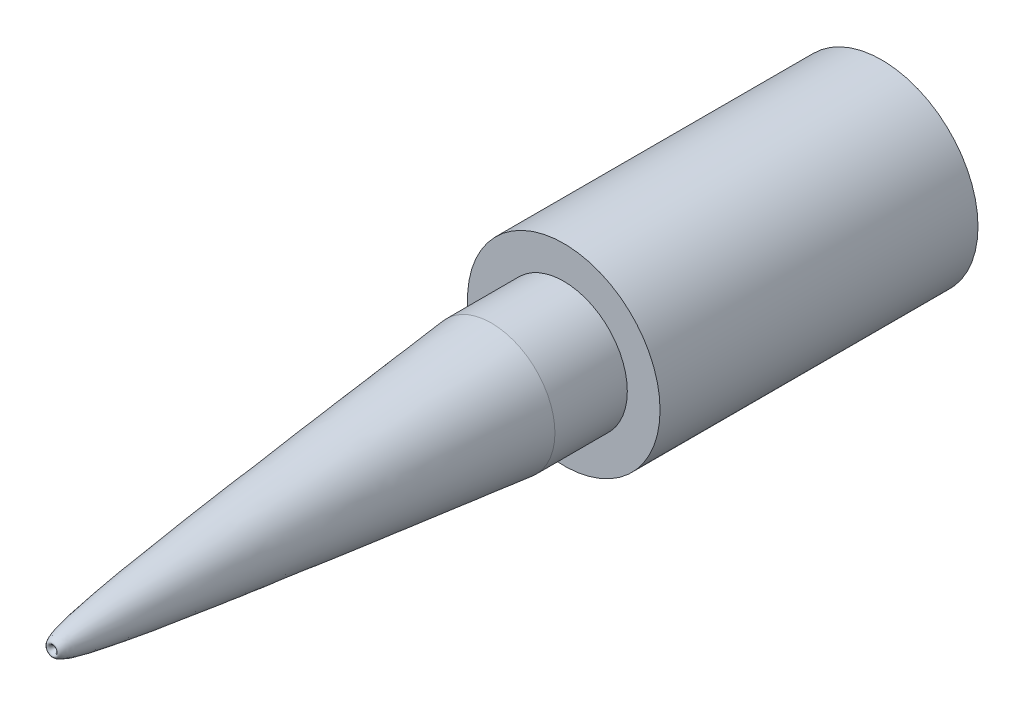
ISO-10303-21;
HEADER;
FILE_DESCRIPTION(('STEP AP214'),'2;1');
FILE_NAME('part.step','',(''),(''),'','','');
FILE_SCHEMA(('AUTOMOTIVE_DESIGN { 1 0 10303 214 1 1 1 1 }'));
ENDSEC;
DATA;
#1=APPLICATION_CONTEXT('core data for automotive mechanical design processes');
#2=APPLICATION_PROTOCOL_DEFINITION('international standard','automotive_design',2000,#1);
#3=PRODUCT_CONTEXT('',#1,'mechanical');
#4=PRODUCT('Part','Part','',(#3));
#5=PRODUCT_RELATED_PRODUCT_CATEGORY('part','',(#4));
#6=PRODUCT_DEFINITION_FORMATION('','',#4);
#7=PRODUCT_DEFINITION_CONTEXT('part definition',#1,'design');
#8=PRODUCT_DEFINITION('design','',#6,#7);
#9=PRODUCT_DEFINITION_SHAPE('','',#8);
#10=(LENGTH_UNIT() NAMED_UNIT(*) SI_UNIT(.MILLI.,.METRE.));
#11=(NAMED_UNIT(*) PLANE_ANGLE_UNIT() SI_UNIT($,.RADIAN.));
#12=(NAMED_UNIT(*) SI_UNIT($,.STERADIAN.) SOLID_ANGLE_UNIT());
#13=UNCERTAINTY_MEASURE_WITH_UNIT(LENGTH_MEASURE(1.E-05),#10,'distance_accuracy_value','');
#14=(GEOMETRIC_REPRESENTATION_CONTEXT(3) GLOBAL_UNCERTAINTY_ASSIGNED_CONTEXT((#13)) GLOBAL_UNIT_ASSIGNED_CONTEXT((#10,
#11,#12)) REPRESENTATION_CONTEXT('',''));
#15=CARTESIAN_POINT('',(0.,0.,0.));
#16=DIRECTION('',(0.,0.,1.));
#17=DIRECTION('',(1.,0.,0.));
#18=AXIS2_PLACEMENT_3D('',#15,#16,#17);
#19=CARTESIAN_POINT('',(0.,0.,31.71));
#20=DIRECTION('',(0.,0.,-1.));
#21=DIRECTION('',(-1.,0.,0.));
#22=AXIS2_PLACEMENT_3D('',#19,#20,#21);
#23=CYLINDRICAL_SURFACE('',#22,9.6);
#24=CARTESIAN_POINT('',(0.,0.,31.71));
#25=DIRECTION('',(0.,0.,1.));
#26=DIRECTION('',(1.,0.,0.));
#27=AXIS2_PLACEMENT_3D('',#24,#25,#26);
#28=CIRCLE('',#27,9.6);
#29=CARTESIAN_POINT('',(9.6,0.,31.71));
#30=VERTEX_POINT('',#29);
#31=EDGE_CURVE('E95',#30,#30,#28,.T.);
#32=ORIENTED_EDGE('',*,*,#31,.F.);
#33=EDGE_LOOP('',(#32));
#34=FACE_BOUND('',#33,.T.);
#35=CARTESIAN_POINT('',(0.,0.,0.));
#36=DIRECTION('',(0.,0.,1.));
#37=DIRECTION('',(1.,0.,0.));
#38=AXIS2_PLACEMENT_3D('',#35,#36,#37);
#39=CIRCLE('',#38,9.6);
#40=CARTESIAN_POINT('',(9.6,0.,0.));
#41=VERTEX_POINT('',#40);
#42=EDGE_CURVE('E91',#41,#41,#39,.T.);
#43=ORIENTED_EDGE('',*,*,#42,.T.);
#44=EDGE_LOOP('',(#43));
#45=FACE_BOUND('',#44,.T.);
#46=ADVANCED_FACE('F45',(#34,#45),#23,.T.);
#47=CARTESIAN_POINT('',(0.,0.,31.71));
#48=DIRECTION('',(0.,0.,1.));
#49=DIRECTION('',(1.,0.,0.));
#50=AXIS2_PLACEMENT_3D('',#47,#48,#49);
#51=PLANE('',#50);
#52=CARTESIAN_POINT('',(0.,0.,31.71));
#53=DIRECTION('',(0.,0.,1.));
#54=DIRECTION('',(1.,0.,0.));
#55=AXIS2_PLACEMENT_3D('',#52,#53,#54);
#56=CIRCLE('',#55,6.335);
#57=CARTESIAN_POINT('',(6.335,0.,31.71));
#58=VERTEX_POINT('',#57);
#59=EDGE_CURVE('E11',#58,#58,#56,.T.);
#60=ORIENTED_EDGE('',*,*,#59,.F.);
#61=EDGE_LOOP('',(#60));
#62=FACE_BOUND('',#61,.T.);
#63=ORIENTED_EDGE('',*,*,#31,.T.);
#64=EDGE_LOOP('',(#63));
#65=FACE_BOUND('',#64,.T.);
#66=ADVANCED_FACE('F123',(#62,#65),#51,.T.);
#67=CARTESIAN_POINT('',(0.,0.,0.));
#68=DIRECTION('',(0.,0.,1.));
#69=DIRECTION('',(1.,0.,0.));
#70=AXIS2_PLACEMENT_3D('',#67,#68,#69);
#71=PLANE('',#70);
#72=CARTESIAN_POINT('',(0.,0.,0.));
#73=DIRECTION('',(0.,0.,-1.));
#74=DIRECTION('',(-1.,0.,0.));
#75=AXIS2_PLACEMENT_3D('',#72,#73,#74);
#76=CIRCLE('',#75,8.42);
#77=CARTESIAN_POINT('',(-8.42,0.,0.));
#78=VERTEX_POINT('',#77);
#79=EDGE_CURVE('E83',#78,#78,#76,.T.);
#80=ORIENTED_EDGE('',*,*,#79,.F.);
#81=EDGE_LOOP('',(#80));
#82=FACE_BOUND('',#81,.T.);
#83=ORIENTED_EDGE('',*,*,#42,.F.);
#84=EDGE_LOOP('',(#83));
#85=FACE_BOUND('',#84,.T.);
#86=ADVANCED_FACE('F128',(#82,#85),#71,.F.);
#87=CARTESIAN_POINT('',(0.,0.,3.01));
#88=DIRECTION('',(0.,0.,-1.));
#89=DIRECTION('',(-1.,0.,0.));
#90=AXIS2_PLACEMENT_3D('',#87,#88,#89);
#91=CYLINDRICAL_SURFACE('',#90,8.42);
#92=CARTESIAN_POINT('',(0.,0.,3.01));
#93=DIRECTION('',(0.,0.,-1.));
#94=DIRECTION('',(-1.,0.,0.));
#95=AXIS2_PLACEMENT_3D('',#92,#93,#94);
#96=CIRCLE('',#95,8.42);
#97=CARTESIAN_POINT('',(-8.42,0.,3.01));
#98=VERTEX_POINT('',#97);
#99=EDGE_CURVE('E87',#98,#98,#96,.T.);
#100=ORIENTED_EDGE('',*,*,#99,.F.);
#101=EDGE_LOOP('',(#100));
#102=FACE_BOUND('',#101,.T.);
#103=ORIENTED_EDGE('',*,*,#79,.T.);
#104=EDGE_LOOP('',(#103));
#105=FACE_BOUND('',#104,.T.);
#106=ADVANCED_FACE('F135',(#102,#105),#91,.F.);
#107=CARTESIAN_POINT('',(0.,0.,3.01));
#108=DIRECTION('',(0.,0.,-1.));
#109=DIRECTION('',(-1.,0.,0.));
#110=AXIS2_PLACEMENT_3D('',#107,#108,#109);
#111=PLANE('',#110);
#112=CARTESIAN_POINT('',(0.,0.,3.01));
#113=DIRECTION('',(0.,0.,-1.));
#114=DIRECTION('',(-1.,0.,0.));
#115=AXIS2_PLACEMENT_3D('',#112,#113,#114);
#116=CIRCLE('',#115,7.185);
#117=CARTESIAN_POINT('',(-7.185,0.,3.01));
#118=VERTEX_POINT('',#117);
#119=EDGE_CURVE('E72',#118,#118,#116,.T.);
#120=ORIENTED_EDGE('',*,*,#119,.F.);
#121=EDGE_LOOP('',(#120));
#122=FACE_BOUND('',#121,.T.);
#123=ORIENTED_EDGE('',*,*,#99,.T.);
#124=EDGE_LOOP('',(#123));
#125=FACE_BOUND('',#124,.T.);
#126=ADVANCED_FACE('F140',(#122,#125),#111,.T.);
#127=CARTESIAN_POINT('',(0.,0.,15.62));
#128=DIRECTION('',(0.,0.,-1.));
#129=DIRECTION('',(-1.,0.,0.));
#130=AXIS2_PLACEMENT_3D('',#127,#128,#129);
#131=CYLINDRICAL_SURFACE('',#130,7.185);
#132=CARTESIAN_POINT('',(0.,0.,15.62));
#133=DIRECTION('',(0.,0.,-1.));
#134=DIRECTION('',(-1.,0.,0.));
#135=AXIS2_PLACEMENT_3D('',#132,#133,#134);
#136=CIRCLE('',#135,7.185);
#137=CARTESIAN_POINT('',(-7.185,0.,15.62));
#138=VERTEX_POINT('',#137);
#139=EDGE_CURVE('E79',#138,#138,#136,.T.);
#140=ORIENTED_EDGE('',*,*,#139,.F.);
#141=EDGE_LOOP('',(#140));
#142=FACE_BOUND('',#141,.T.);
#143=ORIENTED_EDGE('',*,*,#119,.T.);
#144=EDGE_LOOP('',(#143));
#145=FACE_BOUND('',#144,.T.);
#146=ADVANCED_FACE('F144',(#142,#145),#131,.F.);
#147=CARTESIAN_POINT('',(0.,0.,15.62));
#148=DIRECTION('',(0.,0.,-1.));
#149=DIRECTION('',(-1.,0.,0.));
#150=AXIS2_PLACEMENT_3D('',#147,#148,#149);
#151=PLANE('',#150);
#152=CARTESIAN_POINT('',(0.,0.,15.62));
#153=DIRECTION('',(0.,0.,-1.));
#154=DIRECTION('',(-1.,0.,0.));
#155=AXIS2_PLACEMENT_3D('',#152,#153,#154);
#156=CIRCLE('',#155,2.);
#157=CARTESIAN_POINT('',(-2.,0.,15.62));
#158=VERTEX_POINT('',#157);
#159=EDGE_CURVE('E68',#158,#158,#156,.T.);
#160=ORIENTED_EDGE('',*,*,#159,.F.);
#161=EDGE_LOOP('',(#160));
#162=FACE_BOUND('',#161,.T.);
#163=ORIENTED_EDGE('',*,*,#139,.T.);
#164=EDGE_LOOP('',(#163));
#165=FACE_BOUND('',#164,.T.);
#166=ADVANCED_FACE('F148',(#162,#165),#151,.T.);
#167=CARTESIAN_POINT('',(0.,0.,6.04));
#168=DIRECTION('',(0.,0.,1.));
#169=DIRECTION('',(1.,0.,0.));
#170=AXIS2_PLACEMENT_3D('',#167,#168,#169);
#171=CYLINDRICAL_SURFACE('',#170,2.);
#172=CARTESIAN_POINT('',(0.,0.,7.37));
#173=DIRECTION('',(0.,0.,-1.));
#174=DIRECTION('',(-1.,0.,0.));
#175=AXIS2_PLACEMENT_3D('',#172,#173,#174);
#176=CIRCLE('',#175,2.);
#177=CARTESIAN_POINT('',(-2.,0.,7.37));
#178=VERTEX_POINT('',#177);
#179=EDGE_CURVE('E50',#178,#178,#176,.F.);
#180=ORIENTED_EDGE('',*,*,#179,.T.);
#181=EDGE_LOOP('',(#180));
#182=FACE_BOUND('',#181,.T.);
#183=ORIENTED_EDGE('',*,*,#159,.T.);
#184=EDGE_LOOP('',(#183));
#185=FACE_BOUND('',#184,.T.);
#186=ADVANCED_FACE('F110',(#182,#185),#171,.T.);
#187=CARTESIAN_POINT('',(0.,0.,6.04));
#188=DIRECTION('',(0.,0.,-1.));
#189=DIRECTION('',(-1.,0.,0.));
#190=AXIS2_PLACEMENT_3D('',#187,#188,#189);
#191=PLANE('',#190);
#192=CARTESIAN_POINT('',(0.,0.,6.04));
#193=DIRECTION('',(0.,0.,-1.));
#194=DIRECTION('',(-1.,0.,0.));
#195=AXIS2_PLACEMENT_3D('',#192,#193,#194);
#196=CIRCLE('',#195,0.670000000000004);
#197=CARTESIAN_POINT('',(-0.670000000000004,0.,6.04));
#198=VERTEX_POINT('',#197);
#199=EDGE_CURVE('E99',#198,#198,#196,.T.);
#200=ORIENTED_EDGE('',*,*,#199,.T.);
#201=EDGE_LOOP('',(#200));
#202=FACE_BOUND('',#201,.T.);
#203=ADVANCED_FACE('F115',(#202),#191,.T.);
#204=CARTESIAN_POINT('',(0.,0.,6.04));
#205=DIRECTION('',(0.,0.,1.));
#206=DIRECTION('',(1.,0.,0.));
#207=AXIS2_PLACEMENT_3D('',#204,#205,#206);
#208=CONICAL_SURFACE('',#207,0.670000000000004,0.785398163397446);
#209=ORIENTED_EDGE('',*,*,#179,.F.);
#210=EDGE_LOOP('',(#209));
#211=FACE_BOUND('',#210,.T.);
#212=ORIENTED_EDGE('',*,*,#199,.F.);
#213=EDGE_LOOP('',(#212));
#214=FACE_BOUND('',#213,.T.);
#215=ADVANCED_FACE('F48',(#211,#214),#208,.T.);
#216=CARTESIAN_POINT('',(0.,0.,38.93));
#217=DIRECTION('',(0.,0.,-1.));
#218=DIRECTION('',(-1.,0.,0.));
#219=AXIS2_PLACEMENT_3D('',#216,#217,#218);
#220=CYLINDRICAL_SURFACE('',#219,6.335);
#221=CARTESIAN_POINT('',(0.,0.,38.93));
#222=DIRECTION('',(0.,0.,1.));
#223=DIRECTION('',(1.,0.,0.));
#224=AXIS2_PLACEMENT_3D('',#221,#222,#223);
#225=CIRCLE('',#224,6.335);
#226=CARTESIAN_POINT('',(6.335,0.,38.93));
#227=VERTEX_POINT('',#226);
#228=EDGE_CURVE('E65',#227,#227,#225,.T.);
#229=ORIENTED_EDGE('',*,*,#228,.F.);
#230=EDGE_LOOP('',(#229));
#231=FACE_BOUND('',#230,.T.);
#232=ORIENTED_EDGE('',*,*,#59,.T.);
#233=EDGE_LOOP('',(#232));
#234=FACE_BOUND('',#233,.T.);
#235=ADVANCED_FACE('F61',(#231,#234),#220,.T.);
#236=CARTESIAN_POINT('',(0.,6.335,38.93));
#237=CARTESIAN_POINT('',(0.,1.36095947436139,86.4412998560151));
#238=CARTESIAN_POINT('',(0.,0.,81.78));
#239=(BOUNDED_CURVE() B_SPLINE_CURVE(2,(#236,#237,#238),.UNSPECIFIED.,.F.,
.F.) B_SPLINE_CURVE_WITH_KNOTS((3,3),(0.,1.),
.UNSPECIFIED.) CURVE() GEOMETRIC_REPRESENTATION_ITEM() RATIONAL_B_SPLINE_CURVE((1.,
1.74527684573887,1.)) REPRESENTATION_ITEM(''));
#240=CARTESIAN_POINT('',(0.,0.,81.78));
#241=DIRECTION('',(0.,0.,1.));
#242=AXIS1_PLACEMENT('',#240,#241);
#243=SURFACE_OF_REVOLUTION('',#239,#242);
#244=CARTESIAN_POINT('',(0.,0.,81.78));
#245=VERTEX_POINT('',#244);
#246=VERTEX_LOOP('',#245);
#247=FACE_BOUND('',#246,.T.);
#248=ORIENTED_EDGE('',*,*,#228,.T.);
#249=EDGE_LOOP('',(#248));
#250=FACE_BOUND('',#249,.T.);
#251=ADVANCED_FACE('F58',(#247,#250),#243,.T.);
#252=CLOSED_SHELL('',(#46,#66,#86,#106,#126,#146,#166,#186,#203,#215,#235,#251));
#253=MANIFOLD_SOLID_BREP('B2',#252);
#254=ADVANCED_BREP_SHAPE_REPRESENTATION('',(#18,#253),#14);
#255=SHAPE_DEFINITION_REPRESENTATION(#9,#254);
ENDSEC;
END-ISO-10303-21;
